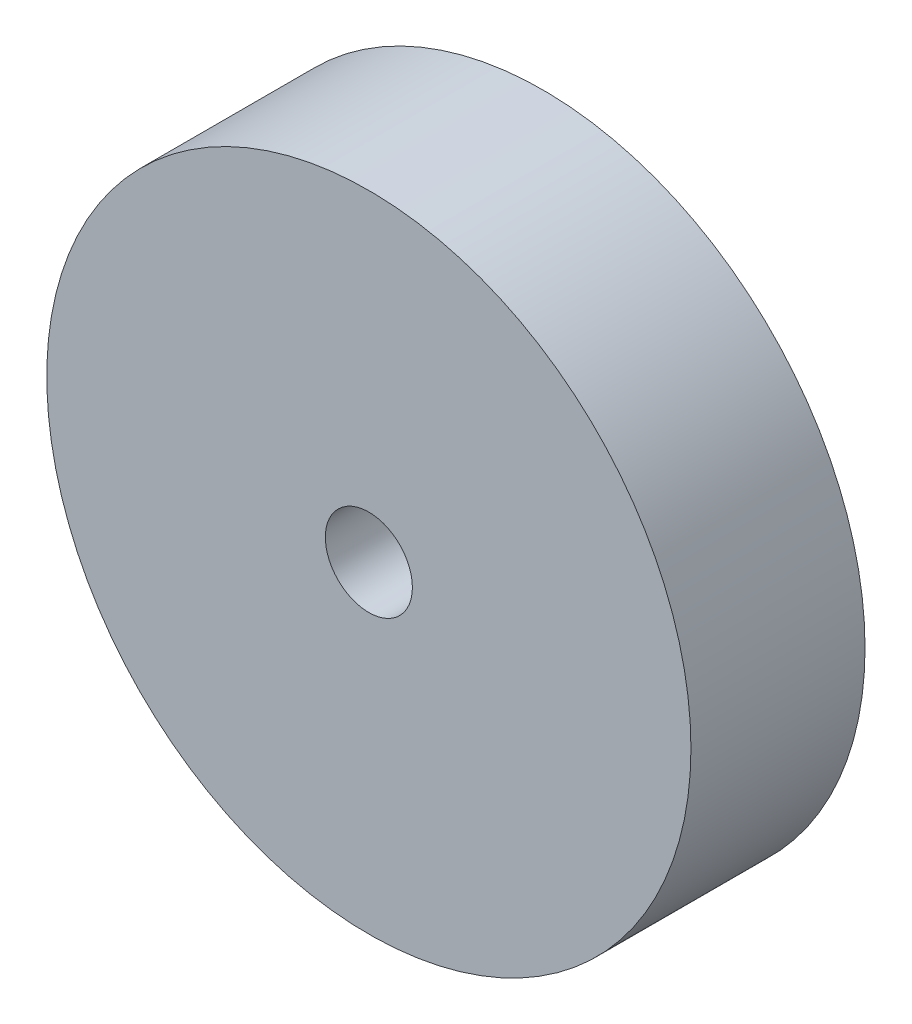
ISO-10303-21;
HEADER;
FILE_DESCRIPTION(('STEP AP214'),'2;1');
FILE_NAME('part.step','',(''),(''),'','','');
FILE_SCHEMA(('AUTOMOTIVE_DESIGN { 1 0 10303 214 1 1 1 1 }'));
ENDSEC;
DATA;
#1=APPLICATION_CONTEXT('core data for automotive mechanical design processes');
#2=APPLICATION_PROTOCOL_DEFINITION('international standard','automotive_design',2000,#1);
#3=PRODUCT_CONTEXT('',#1,'mechanical');
#4=PRODUCT('Part','Part','',(#3));
#5=PRODUCT_RELATED_PRODUCT_CATEGORY('part','',(#4));
#6=PRODUCT_DEFINITION_FORMATION('','',#4);
#7=PRODUCT_DEFINITION_CONTEXT('part definition',#1,'design');
#8=PRODUCT_DEFINITION('design','',#6,#7);
#9=PRODUCT_DEFINITION_SHAPE('','',#8);
#10=(LENGTH_UNIT() NAMED_UNIT(*) SI_UNIT(.MILLI.,.METRE.));
#11=(NAMED_UNIT(*) PLANE_ANGLE_UNIT() SI_UNIT($,.RADIAN.));
#12=(NAMED_UNIT(*) SI_UNIT($,.STERADIAN.) SOLID_ANGLE_UNIT());
#13=UNCERTAINTY_MEASURE_WITH_UNIT(LENGTH_MEASURE(1.E-05),#10,'distance_accuracy_value','');
#14=(GEOMETRIC_REPRESENTATION_CONTEXT(3) GLOBAL_UNCERTAINTY_ASSIGNED_CONTEXT((#13)) GLOBAL_UNIT_ASSIGNED_CONTEXT((#10,
#11,#12)) REPRESENTATION_CONTEXT('',''));
#15=CARTESIAN_POINT('',(0.,0.,0.));
#16=DIRECTION('',(0.,0.,1.));
#17=DIRECTION('',(1.,0.,0.));
#18=AXIS2_PLACEMENT_3D('',#15,#16,#17);
#19=CARTESIAN_POINT('',(0.,0.,5.));
#20=DIRECTION('',(0.,0.,1.));
#21=DIRECTION('',(1.,0.,0.));
#22=AXIS2_PLACEMENT_3D('',#19,#20,#21);
#23=PLANE('',#22);
#24=CARTESIAN_POINT('',(0.,0.,5.));
#25=DIRECTION('',(0.,0.,1.));
#26=DIRECTION('',(1.,0.,0.));
#27=AXIS2_PLACEMENT_3D('',#24,#25,#26);
#28=CIRCLE('',#27,1.24999999999999);
#29=CARTESIAN_POINT('',(1.24999999999999,0.,5.));
#30=VERTEX_POINT('',#29);
#31=EDGE_CURVE('E58',#30,#30,#28,.T.);
#32=ORIENTED_EDGE('',*,*,#31,.F.);
#33=EDGE_LOOP('',(#32));
#34=FACE_BOUND('',#33,.T.);
#35=CARTESIAN_POINT('',(0.,0.,5.));
#36=DIRECTION('',(0.,0.,1.));
#37=DIRECTION('',(1.,0.,0.));
#38=AXIS2_PLACEMENT_3D('',#35,#36,#37);
#39=CIRCLE('',#38,9.25);
#40=CARTESIAN_POINT('',(9.25,0.,5.));
#41=VERTEX_POINT('',#40);
#42=EDGE_CURVE('E10',#41,#41,#39,.T.);
#43=ORIENTED_EDGE('',*,*,#42,.T.);
#44=EDGE_LOOP('',(#43));
#45=FACE_BOUND('',#44,.T.);
#46=ADVANCED_FACE('F40',(#34,#45),#23,.T.);
#47=CARTESIAN_POINT('',(0.,0.,0.));
#48=DIRECTION('',(0.,0.,1.));
#49=DIRECTION('',(1.,0.,0.));
#50=AXIS2_PLACEMENT_3D('',#47,#48,#49);
#51=PLANE('',#50);
#52=CARTESIAN_POINT('',(0.,0.,0.));
#53=DIRECTION('',(0.,0.,1.));
#54=DIRECTION('',(1.,0.,0.));
#55=AXIS2_PLACEMENT_3D('',#52,#53,#54);
#56=CIRCLE('',#55,1.24999999999999);
#57=CARTESIAN_POINT('',(1.24999999999999,0.,0.));
#58=VERTEX_POINT('',#57);
#59=EDGE_CURVE('E53',#58,#58,#56,.T.);
#60=ORIENTED_EDGE('',*,*,#59,.T.);
#61=EDGE_LOOP('',(#60));
#62=FACE_BOUND('',#61,.T.);
#63=CARTESIAN_POINT('',(0.,0.,0.));
#64=DIRECTION('',(0.,0.,1.));
#65=DIRECTION('',(1.,0.,0.));
#66=AXIS2_PLACEMENT_3D('',#63,#64,#65);
#67=CIRCLE('',#66,9.25);
#68=CARTESIAN_POINT('',(9.25,0.,0.));
#69=VERTEX_POINT('',#68);
#70=EDGE_CURVE('E44',#69,#69,#67,.T.);
#71=ORIENTED_EDGE('',*,*,#70,.F.);
#72=EDGE_LOOP('',(#71));
#73=FACE_BOUND('',#72,.T.);
#74=ADVANCED_FACE('F66',(#62,#73),#51,.F.);
#75=CARTESIAN_POINT('',(0.,0.,5.));
#76=DIRECTION('',(0.,0.,-1.));
#77=DIRECTION('',(-1.,0.,0.));
#78=AXIS2_PLACEMENT_3D('',#75,#76,#77);
#79=CYLINDRICAL_SURFACE('',#78,9.25);
#80=ORIENTED_EDGE('',*,*,#42,.F.);
#81=EDGE_LOOP('',(#80));
#82=FACE_BOUND('',#81,.T.);
#83=ORIENTED_EDGE('',*,*,#70,.T.);
#84=EDGE_LOOP('',(#83));
#85=FACE_BOUND('',#84,.T.);
#86=ADVANCED_FACE('F42',(#82,#85),#79,.T.);
#87=CARTESIAN_POINT('',(0.,0.,5.));
#88=DIRECTION('',(0.,0.,1.));
#89=DIRECTION('',(1.,0.,0.));
#90=AXIS2_PLACEMENT_3D('',#87,#88,#89);
#91=CYLINDRICAL_SURFACE('',#90,1.24999999999999);
#92=ORIENTED_EDGE('',*,*,#59,.F.);
#93=EDGE_LOOP('',(#92));
#94=FACE_BOUND('',#93,.T.);
#95=ORIENTED_EDGE('',*,*,#31,.T.);
#96=EDGE_LOOP('',(#95));
#97=FACE_BOUND('',#96,.T.);
#98=ADVANCED_FACE('F63',(#94,#97),#91,.F.);
#99=CLOSED_SHELL('',(#46,#74,#86,#98));
#100=MANIFOLD_SOLID_BREP('B2',#99);
#101=ADVANCED_BREP_SHAPE_REPRESENTATION('',(#18,#100),#14);
#102=SHAPE_DEFINITION_REPRESENTATION(#9,#101);
ENDSEC;
END-ISO-10303-21;
